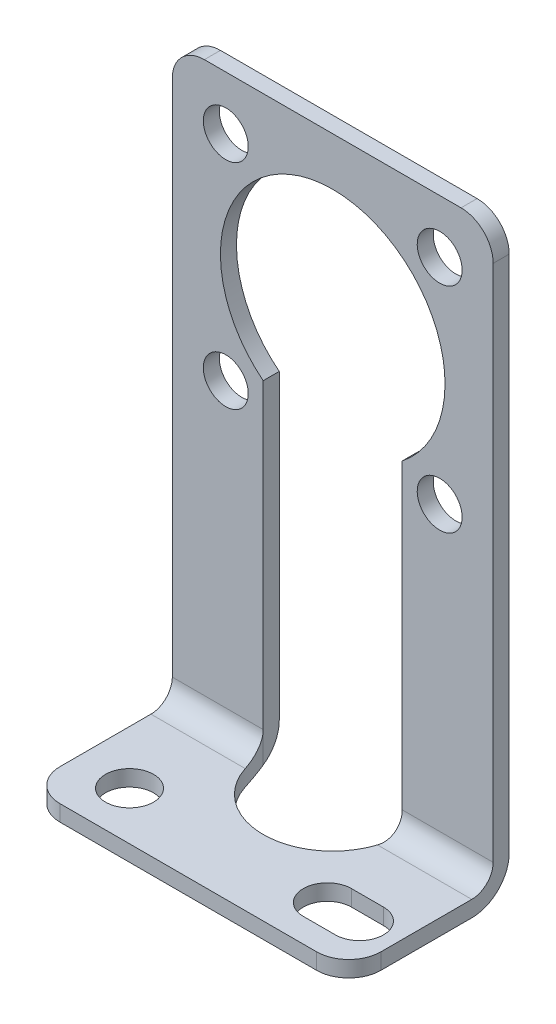
ISO-10303-21;
HEADER;
FILE_DESCRIPTION(('STEP AP214'),'2;1');
FILE_NAME('part.step','',(''),(''),'','','');
FILE_SCHEMA(('AUTOMOTIVE_DESIGN { 1 0 10303 214 1 1 1 1 }'));
ENDSEC;
DATA;
#1=APPLICATION_CONTEXT('core data for automotive mechanical design processes');
#2=APPLICATION_PROTOCOL_DEFINITION('international standard','automotive_design',2000,#1);
#3=PRODUCT_CONTEXT('',#1,'mechanical');
#4=PRODUCT('Part','Part','',(#3));
#5=PRODUCT_RELATED_PRODUCT_CATEGORY('part','',(#4));
#6=PRODUCT_DEFINITION_FORMATION('','',#4);
#7=PRODUCT_DEFINITION_CONTEXT('part definition',#1,'design');
#8=PRODUCT_DEFINITION('design','',#6,#7);
#9=PRODUCT_DEFINITION_SHAPE('','',#8);
#10=(LENGTH_UNIT() NAMED_UNIT(*) SI_UNIT(.MILLI.,.METRE.));
#11=(NAMED_UNIT(*) PLANE_ANGLE_UNIT() SI_UNIT($,.RADIAN.));
#12=(NAMED_UNIT(*) SI_UNIT($,.STERADIAN.) SOLID_ANGLE_UNIT());
#13=UNCERTAINTY_MEASURE_WITH_UNIT(LENGTH_MEASURE(1.E-05),#10,'distance_accuracy_value','');
#14=(GEOMETRIC_REPRESENTATION_CONTEXT(3) GLOBAL_UNCERTAINTY_ASSIGNED_CONTEXT((#13)) GLOBAL_UNIT_ASSIGNED_CONTEXT((#10,
#11,#12)) REPRESENTATION_CONTEXT('',''));
#15=CARTESIAN_POINT('',(0.,0.,0.));
#16=DIRECTION('',(0.,0.,1.));
#17=DIRECTION('',(1.,0.,0.));
#18=AXIS2_PLACEMENT_3D('',#15,#16,#17);
#19=CARTESIAN_POINT('',(23.5,55.001,-4.50000000000001));
#20=DIRECTION('',(0.,-1.,0.));
#21=DIRECTION('',(0.,0.,-1.));
#22=AXIS2_PLACEMENT_3D('',#19,#20,#21);
#23=CYLINDRICAL_SURFACE('',#22,2.25);
#24=DIRECTION('',(0.,1.,0.));
#25=VECTOR('',#24,1.);
#26=CARTESIAN_POINT('',(23.5,55.001,-2.25000000000001));
#27=LINE('',#26,#25);
#28=CARTESIAN_POINT('',(23.5,1.50000000000001,-2.25000000000001));
#29=VERTEX_POINT('',#28);
#30=CARTESIAN_POINT('',(23.5,0.,-2.25000000000001));
#31=VERTEX_POINT('',#30);
#32=EDGE_CURVE('E229',#29,#31,#27,.F.);
#33=ORIENTED_EDGE('',*,*,#32,.T.);
#34=CARTESIAN_POINT('',(23.5,0.,-4.50000000000001));
#35=DIRECTION('',(0.,-1.,0.));
#36=DIRECTION('',(0.,0.,-1.));
#37=AXIS2_PLACEMENT_3D('',#34,#35,#36);
#38=CIRCLE('',#37,2.25);
#39=CARTESIAN_POINT('',(23.5,0.,-6.75000000000001));
#40=VERTEX_POINT('',#39);
#41=EDGE_CURVE('E205',#31,#40,#38,.T.);
#42=ORIENTED_EDGE('',*,*,#41,.T.);
#43=DIRECTION('',(0.,1.,0.));
#44=VECTOR('',#43,1.);
#45=CARTESIAN_POINT('',(23.5,55.001,-6.75000000000001));
#46=LINE('',#45,#44);
#47=CARTESIAN_POINT('',(23.5,1.50000000000001,-6.75000000000001));
#48=VERTEX_POINT('',#47);
#49=EDGE_CURVE('E222',#40,#48,#46,.T.);
#50=ORIENTED_EDGE('',*,*,#49,.T.);
#51=CARTESIAN_POINT('',(23.5,1.50000000000001,-4.50000000000001));
#52=DIRECTION('',(0.,-1.,0.));
#53=DIRECTION('',(0.,0.,-1.));
#54=AXIS2_PLACEMENT_3D('',#51,#52,#53);
#55=CIRCLE('',#54,2.25);
#56=EDGE_CURVE('E351',#48,#29,#55,.F.);
#57=ORIENTED_EDGE('',*,*,#56,.T.);
#58=EDGE_LOOP('',(#33,#42,#50,#57));
#59=FACE_BOUND('',#58,.T.);
#60=ADVANCED_FACE('F16',(#59),#23,.F.);
#61=CARTESIAN_POINT('',(26.5,55.001,-2.25000000000001));
#62=DIRECTION('',(0.,0.,1.));
#63=DIRECTION('',(1.,0.,0.));
#64=AXIS2_PLACEMENT_3D('',#61,#62,#63);
#65=PLANE('',#64);
#66=DIRECTION('',(0.,-1.,0.));
#67=VECTOR('',#66,1.);
#68=CARTESIAN_POINT('',(26.5,55.001,-2.25000000000001));
#69=LINE('',#68,#67);
#70=CARTESIAN_POINT('',(26.5,1.50000000000002,-2.25000000000001));
#71=VERTEX_POINT('',#70);
#72=CARTESIAN_POINT('',(26.5,0.,-2.25000000000001));
#73=VERTEX_POINT('',#72);
#74=EDGE_CURVE('E225',#71,#73,#69,.T.);
#75=ORIENTED_EDGE('',*,*,#74,.T.);
#76=DIRECTION('',(1.,0.,0.));
#77=VECTOR('',#76,1.);
#78=CARTESIAN_POINT('',(30.,0.,-2.25000000000001));
#79=LINE('',#78,#77);
#80=EDGE_CURVE('E197',#73,#31,#79,.F.);
#81=ORIENTED_EDGE('',*,*,#80,.T.);
#82=ORIENTED_EDGE('',*,*,#32,.F.);
#83=DIRECTION('',(1.,0.,0.));
#84=VECTOR('',#83,1.);
#85=CARTESIAN_POINT('',(30.,1.5,-2.25000000000001));
#86=LINE('',#85,#84);
#87=EDGE_CURVE('E350',#29,#71,#86,.T.);
#88=ORIENTED_EDGE('',*,*,#87,.T.);
#89=EDGE_LOOP('',(#75,#81,#82,#88));
#90=FACE_BOUND('',#89,.T.);
#91=ADVANCED_FACE('F507',(#90),#65,.F.);
#92=CARTESIAN_POINT('',(26.5,55.001,-4.50000000000001));
#93=DIRECTION('',(0.,-1.,0.));
#94=DIRECTION('',(0.,0.,-1.));
#95=AXIS2_PLACEMENT_3D('',#92,#93,#94);
#96=CYLINDRICAL_SURFACE('',#95,2.25);
#97=DIRECTION('',(0.,1.,0.));
#98=VECTOR('',#97,1.);
#99=CARTESIAN_POINT('',(26.5,55.001,-6.75000000000001));
#100=LINE('',#99,#98);
#101=CARTESIAN_POINT('',(26.5,1.50000000000002,-6.75000000000001));
#102=VERTEX_POINT('',#101);
#103=CARTESIAN_POINT('',(26.5,0.,-6.75000000000001));
#104=VERTEX_POINT('',#103);
#105=EDGE_CURVE('E223',#102,#104,#100,.F.);
#106=ORIENTED_EDGE('',*,*,#105,.T.);
#107=CARTESIAN_POINT('',(26.5,0.,-4.50000000000001));
#108=DIRECTION('',(0.,-1.,0.));
#109=DIRECTION('',(0.,0.,-1.));
#110=AXIS2_PLACEMENT_3D('',#107,#108,#109);
#111=CIRCLE('',#110,2.25);
#112=EDGE_CURVE('E201',#104,#73,#111,.T.);
#113=ORIENTED_EDGE('',*,*,#112,.T.);
#114=ORIENTED_EDGE('',*,*,#74,.F.);
#115=CARTESIAN_POINT('',(26.5,1.50000000000003,-4.50000000000001));
#116=DIRECTION('',(0.,-1.,0.));
#117=DIRECTION('',(0.,0.,-1.));
#118=AXIS2_PLACEMENT_3D('',#115,#116,#117);
#119=CIRCLE('',#118,2.25);
#120=EDGE_CURVE('E347',#71,#102,#119,.F.);
#121=ORIENTED_EDGE('',*,*,#120,.T.);
#122=EDGE_LOOP('',(#106,#113,#114,#121));
#123=FACE_BOUND('',#122,.T.);
#124=ADVANCED_FACE('F517',(#123),#96,.F.);
#125=CARTESIAN_POINT('',(26.5,55.001,-6.75000000000001));
#126=DIRECTION('',(0.,0.,-1.));
#127=DIRECTION('',(-1.,0.,0.));
#128=AXIS2_PLACEMENT_3D('',#125,#126,#127);
#129=PLANE('',#128);
#130=ORIENTED_EDGE('',*,*,#49,.F.);
#131=DIRECTION('',(1.,0.,0.));
#132=VECTOR('',#131,1.);
#133=CARTESIAN_POINT('',(30.,0.,-6.75000000000001));
#134=LINE('',#133,#132);
#135=EDGE_CURVE('E202',#40,#104,#134,.T.);
#136=ORIENTED_EDGE('',*,*,#135,.T.);
#137=ORIENTED_EDGE('',*,*,#105,.F.);
#138=DIRECTION('',(1.,0.,0.));
#139=VECTOR('',#138,1.);
#140=CARTESIAN_POINT('',(30.,1.50000000000001,-6.75000000000001));
#141=LINE('',#140,#139);
#142=EDGE_CURVE('E346',#102,#48,#141,.F.);
#143=ORIENTED_EDGE('',*,*,#142,.T.);
#144=EDGE_LOOP('',(#130,#136,#137,#143));
#145=FACE_BOUND('',#144,.T.);
#146=ADVANCED_FACE('F515',(#145),#129,.F.);
#147=CARTESIAN_POINT('',(5.,55.001,-4.50000000000001));
#148=DIRECTION('',(0.,-1.,0.));
#149=DIRECTION('',(0.,0.,-1.));
#150=AXIS2_PLACEMENT_3D('',#147,#148,#149);
#151=CYLINDRICAL_SURFACE('',#150,2.25);
#152=CARTESIAN_POINT('',(5.,0.,-4.50000000000001));
#153=DIRECTION('',(0.,-1.,0.));
#154=DIRECTION('',(0.,0.,-1.));
#155=AXIS2_PLACEMENT_3D('',#152,#153,#154);
#156=CIRCLE('',#155,2.25);
#157=CARTESIAN_POINT('',(5.,0.,-6.75000000000001));
#158=VERTEX_POINT('',#157);
#159=EDGE_CURVE('E200',#158,#158,#156,.T.);
#160=ORIENTED_EDGE('',*,*,#159,.T.);
#161=EDGE_LOOP('',(#160));
#162=FACE_BOUND('',#161,.T.);
#163=CARTESIAN_POINT('',(5.,1.5,-4.50000000000001));
#164=DIRECTION('',(0.,-1.,0.));
#165=DIRECTION('',(0.,0.,-1.));
#166=AXIS2_PLACEMENT_3D('',#163,#164,#165);
#167=CIRCLE('',#166,2.25);
#168=CARTESIAN_POINT('',(5.,1.5,-6.75000000000001));
#169=VERTEX_POINT('',#168);
#170=EDGE_CURVE('E343',#169,#169,#167,.F.);
#171=ORIENTED_EDGE('',*,*,#170,.T.);
#172=EDGE_LOOP('',(#171));
#173=FACE_BOUND('',#172,.T.);
#174=ADVANCED_FACE('F670',(#162,#173),#151,.F.);
#175=CARTESIAN_POINT('',(27.,0.,-3.));
#176=DIRECTION('',(0.,-1.,0.));
#177=DIRECTION('',(0.,0.,-1.));
#178=AXIS2_PLACEMENT_3D('',#175,#176,#177);
#179=CYLINDRICAL_SURFACE('',#178,3.);
#180=CARTESIAN_POINT('',(27.,0.,-3.));
#181=DIRECTION('',(0.,-1.,0.));
#182=DIRECTION('',(0.,0.,-1.));
#183=AXIS2_PLACEMENT_3D('',#180,#181,#182);
#184=CIRCLE('',#183,3.);
#185=CARTESIAN_POINT('',(27.,0.,0.));
#186=VERTEX_POINT('',#185);
#187=CARTESIAN_POINT('',(30.,0.,-3.));
#188=VERTEX_POINT('',#187);
#189=EDGE_CURVE('E186',#186,#188,#184,.F.);
#190=ORIENTED_EDGE('',*,*,#189,.T.);
#191=DIRECTION('',(0.,-1.,0.));
#192=VECTOR('',#191,1.);
#193=CARTESIAN_POINT('',(30.,0.,-3.));
#194=LINE('',#193,#192);
#195=CARTESIAN_POINT('',(30.,1.50000000000001,-3.));
#196=VERTEX_POINT('',#195);
#197=EDGE_CURVE('E220',#188,#196,#194,.F.);
#198=ORIENTED_EDGE('',*,*,#197,.T.);
#199=CARTESIAN_POINT('',(27.,1.50000000000001,-3.));
#200=DIRECTION('',(0.,-1.,0.));
#201=DIRECTION('',(0.,0.,-1.));
#202=AXIS2_PLACEMENT_3D('',#199,#200,#201);
#203=CIRCLE('',#202,3.);
#204=CARTESIAN_POINT('',(27.,1.5,0.));
#205=VERTEX_POINT('',#204);
#206=EDGE_CURVE('E340',#196,#205,#203,.T.);
#207=ORIENTED_EDGE('',*,*,#206,.T.);
#208=DIRECTION('',(0.,1.,0.));
#209=VECTOR('',#208,1.);
#210=CARTESIAN_POINT('',(27.,0.,0.));
#211=LINE('',#210,#209);
#212=EDGE_CURVE('E218',#205,#186,#211,.F.);
#213=ORIENTED_EDGE('',*,*,#212,.T.);
#214=EDGE_LOOP('',(#190,#198,#207,#213));
#215=FACE_BOUND('',#214,.T.);
#216=ADVANCED_FACE('F661',(#215),#179,.T.);
#217=CARTESIAN_POINT('',(30.,0.,0.));
#218=DIRECTION('',(0.,0.,-1.));
#219=DIRECTION('',(-1.,0.,0.));
#220=AXIS2_PLACEMENT_3D('',#217,#218,#219);
#221=PLANE('',#220);
#222=DIRECTION('',(0.,1.,0.));
#223=VECTOR('',#222,1.);
#224=CARTESIAN_POINT('',(3.,0.,0.));
#225=LINE('',#224,#223);
#226=CARTESIAN_POINT('',(3.,0.,0.));
#227=VERTEX_POINT('',#226);
#228=CARTESIAN_POINT('',(3.,1.5,0.));
#229=VERTEX_POINT('',#228);
#230=EDGE_CURVE('E170',#227,#229,#225,.T.);
#231=ORIENTED_EDGE('',*,*,#230,.F.);
#232=DIRECTION('',(1.,0.,0.));
#233=VECTOR('',#232,1.);
#234=CARTESIAN_POINT('',(30.,0.,0.));
#235=LINE('',#234,#233);
#236=EDGE_CURVE('E189',#227,#186,#235,.T.);
#237=ORIENTED_EDGE('',*,*,#236,.T.);
#238=ORIENTED_EDGE('',*,*,#212,.F.);
#239=DIRECTION('',(1.,0.,0.));
#240=VECTOR('',#239,1.);
#241=CARTESIAN_POINT('',(30.,1.5,0.));
#242=LINE('',#241,#240);
#243=EDGE_CURVE('E339',#205,#229,#242,.F.);
#244=ORIENTED_EDGE('',*,*,#243,.T.);
#245=EDGE_LOOP('',(#231,#237,#238,#244));
#246=FACE_BOUND('',#245,.T.);
#247=ADVANCED_FACE('F652',(#246),#221,.F.);
#248=CARTESIAN_POINT('',(3.,0.,-3.));
#249=DIRECTION('',(0.,1.,0.));
#250=DIRECTION('',(0.,0.,1.));
#251=AXIS2_PLACEMENT_3D('',#248,#249,#250);
#252=CYLINDRICAL_SURFACE('',#251,3.);
#253=CARTESIAN_POINT('',(3.,0.,-3.));
#254=DIRECTION('',(0.,1.,0.));
#255=DIRECTION('',(0.,0.,1.));
#256=AXIS2_PLACEMENT_3D('',#253,#254,#255);
#257=CIRCLE('',#256,3.);
#258=CARTESIAN_POINT('',(0.,0.,-3.));
#259=VERTEX_POINT('',#258);
#260=EDGE_CURVE('E196',#259,#227,#257,.T.);
#261=ORIENTED_EDGE('',*,*,#260,.T.);
#262=ORIENTED_EDGE('',*,*,#230,.T.);
#263=CARTESIAN_POINT('',(3.,1.5,-3.));
#264=DIRECTION('',(0.,1.,0.));
#265=DIRECTION('',(0.,0.,1.));
#266=AXIS2_PLACEMENT_3D('',#263,#264,#265);
#267=CIRCLE('',#266,3.);
#268=CARTESIAN_POINT('',(0.,1.5,-3.));
#269=VERTEX_POINT('',#268);
#270=EDGE_CURVE('E336',#229,#269,#267,.F.);
#271=ORIENTED_EDGE('',*,*,#270,.T.);
#272=DIRECTION('',(0.,1.,0.));
#273=VECTOR('',#272,1.);
#274=CARTESIAN_POINT('',(0.,0.,-3.));
#275=LINE('',#274,#273);
#276=EDGE_CURVE('E216',#269,#259,#275,.F.);
#277=ORIENTED_EDGE('',*,*,#276,.T.);
#278=EDGE_LOOP('',(#261,#262,#271,#277));
#279=FACE_BOUND('',#278,.T.);
#280=ADVANCED_FACE('F645',(#279),#252,.T.);
#281=CARTESIAN_POINT('',(30.,3.5,-11.5));
#282=DIRECTION('',(-1.,0.,0.));
#283=DIRECTION('',(0.,0.,1.));
#284=AXIS2_PLACEMENT_3D('',#281,#282,#283);
#285=CYLINDRICAL_SURFACE('',#284,3.5);
#286=CARTESIAN_POINT('',(21.5,3.5,-11.5));
#287=DIRECTION('',(-1.,0.,0.));
#288=DIRECTION('',(0.,0.,1.));
#289=AXIS2_PLACEMENT_3D('',#286,#287,#288);
#290=CIRCLE('',#289,3.5);
#291=CARTESIAN_POINT('',(21.5,0.627718676730986,-13.5));
#292=VERTEX_POINT('',#291);
#293=CARTESIAN_POINT('',(21.5,3.5,-15.));
#294=VERTEX_POINT('',#293);
#295=EDGE_CURVE('E485',#292,#294,#290,.F.);
#296=ORIENTED_EDGE('',*,*,#295,.T.);
#297=DIRECTION('',(1.,0.,0.));
#298=VECTOR('',#297,1.);
#299=CARTESIAN_POINT('',(30.,3.5,-15.));
#300=LINE('',#299,#298);
#301=CARTESIAN_POINT('',(30.,3.5,-15.));
#302=VERTEX_POINT('',#301);
#303=EDGE_CURVE('E169',#294,#302,#300,.T.);
#304=ORIENTED_EDGE('',*,*,#303,.T.);
#305=CARTESIAN_POINT('',(30.,3.5,-11.5));
#306=DIRECTION('',(-1.,0.,0.));
#307=DIRECTION('',(0.,0.,1.));
#308=AXIS2_PLACEMENT_3D('',#305,#306,#307);
#309=CIRCLE('',#308,3.5);
#310=CARTESIAN_POINT('',(30.,0.,-11.5));
#311=VERTEX_POINT('',#310);
#312=EDGE_CURVE('E185',#302,#311,#309,.T.);
#313=ORIENTED_EDGE('',*,*,#312,.T.);
#314=DIRECTION('',(1.,0.,0.));
#315=VECTOR('',#314,1.);
#316=CARTESIAN_POINT('',(30.,0.,-11.5));
#317=LINE('',#316,#315);
#318=CARTESIAN_POINT('',(21.1846584384265,0.,-11.5));
#319=VERTEX_POINT('',#318);
#320=EDGE_CURVE('E176',#311,#319,#317,.F.);
#321=ORIENTED_EDGE('',*,*,#320,.T.);
#322=CARTESIAN_POINT('',(21.1846584384265,0.,-11.5));
#323=CARTESIAN_POINT('',(21.2126192461021,-1.47776893110457E-05,-11.5864103152324));
#324=CARTESIAN_POINT('',(21.2387426422125,0.00319974592441999,-11.6734305971561));
#325=CARTESIAN_POINT('',(21.2872230381251,0.0162507806863622,-11.8480375639755));
#326=CARTESIAN_POINT('',(21.3095793342303,0.0260885273467275,-11.9356243515288));
#327=CARTESIAN_POINT('',(21.34985016532,0.052178115311759,-12.1082210105445));
#328=CARTESIAN_POINT('',(21.3678717713789,0.0682421486276391,-12.1932341998812));
#329=CARTESIAN_POINT('',(21.4002698055881,0.106820423426476,-12.3624743543069));
#330=CARTESIAN_POINT('',(21.4146468181527,0.129333629543181,-12.4467014433588));
#331=CARTESIAN_POINT('',(21.439983274154,0.181050013754739,-12.6146170374571));
#332=CARTESIAN_POINT('',(21.4509042366898,0.210322641547532,-12.69828996839));
#333=CARTESIAN_POINT('',(21.4692960360574,0.275293974888231,-12.8635080589744));
#334=CARTESIAN_POINT('',(21.476766251039,0.310993837061454,-12.9450528326201));
#335=CARTESIAN_POINT('',(21.488677716582,0.389746198571779,-13.1077049800465));
#336=CARTESIAN_POINT('',(21.4930241065601,0.432983024819098,-13.1887299852529));
#337=CARTESIAN_POINT('',(21.4986901404819,0.525725831234505,-13.3472000626112));
#338=CARTESIAN_POINT('',(21.5000103793516,0.575230577141507,-13.4246458354881));
#339=CARTESIAN_POINT('',(21.5,0.627718676730986,-13.5));
#340=B_SPLINE_CURVE_WITH_KNOTS('',3,(#322,#323,#324,#325,#326,#327,#328,#329,#330,#331,#332,
#333,#334,#335,#336,#337,#338,#339),.UNSPECIFIED.,.F.,.F.,(4,2,2,2,2,2,2,2,4),(0.,
0.272409508598649,0.544869847215541,0.80968171777927,1.07445109858935,1.34207247539775,
1.60974206075261,1.88523110619515,2.16066598723716),.UNSPECIFIED.);
#341=EDGE_CURVE('E19',#319,#292,#340,.T.);
#342=ORIENTED_EDGE('',*,*,#341,.T.);
#343=EDGE_LOOP('',(#296,#304,#313,#321,#342));
#344=FACE_BOUND('',#343,.T.);
#345=ADVANCED_FACE('F183',(#344),#285,.T.);
#346=CARTESIAN_POINT('',(15.,55.001,-13.5));
#347=DIRECTION('',(0.,-1.,0.));
#348=DIRECTION('',(0.,0.,-1.));
#349=AXIS2_PLACEMENT_3D('',#346,#347,#348);
#350=CYLINDRICAL_SURFACE('',#349,6.5);
#351=CARTESIAN_POINT('',(8.5,0.627718676730986,-13.5));
#352=CARTESIAN_POINT('',(8.49999012513292,0.575820713429753,-13.4254921194431));
#353=CARTESIAN_POINT('',(8.50128062178582,0.526839008212426,-13.3489399976596));
#354=CARTESIAN_POINT('',(8.50681542744663,0.434999405386153,-13.1923316167673));
#355=CARTESIAN_POINT('',(8.51106026996644,0.392142615533008,-13.1122747271957));
#356=CARTESIAN_POINT('',(8.52269145668762,0.313976258803868,-12.9515572646888));
#357=CARTESIAN_POINT('',(8.52998623421595,0.278488548313346,-12.8709767764647));
#358=CARTESIAN_POINT('',(8.5479446252212,0.213795215819289,-12.7077107568048));
#359=CARTESIAN_POINT('',(8.55860770143075,0.1845885931859,-12.6250255630168));
#360=CARTESIAN_POINT('',(8.58362008864896,0.132286428149437,-12.4572427890859));
#361=CARTESIAN_POINT('',(8.59800970855165,0.109263701811073,-12.372128504525));
#362=CARTESIAN_POINT('',(8.6305125344359,0.0698096568207672,-12.2010719767515));
#363=CARTESIAN_POINT('',(8.64862641175557,0.0533795281348591,-12.1151295869298));
#364=CARTESIAN_POINT('',(8.6891743570207,0.0266900653865563,-11.9406020232384));
#365=CARTESIAN_POINT('',(8.71171913339047,0.0166249351059505,-11.8520129605245));
#366=CARTESIAN_POINT('',(8.76066362443995,0.00327282505407418,-11.6754078524712));
#367=CARTESIAN_POINT('',(8.78706256326093,-1.55169034032131E-05,-11.5873916955196));
#368=CARTESIAN_POINT('',(8.81534156157351,0.,-11.5));
#369=B_SPLINE_CURVE_WITH_KNOTS('',3,(#351,#352,#353,#354,#355,#356,#357,#358,#359,#360,#361,
#362,#363,#364,#365,#366,#367,#368),.UNSPECIFIED.,.F.,.F.,(4,2,2,2,2,2,2,2,4),(0.,
0.272341587759512,0.544732369213966,0.80947390937836,1.07417324270629,1.34186490849213,
1.60960487099892,1.88516312555608,2.16066598539506),.UNSPECIFIED.);
#370=CARTESIAN_POINT('',(8.5,0.627718676730986,-13.5));
#371=VERTEX_POINT('',#370);
#372=CARTESIAN_POINT('',(8.81534156157351,0.,-11.5));
#373=VERTEX_POINT('',#372);
#374=EDGE_CURVE('E208',#371,#373,#369,.T.);
#375=ORIENTED_EDGE('',*,*,#374,.F.);
#376=DIRECTION('',(0.,-1.,0.));
#377=VECTOR('',#376,1.);
#378=CARTESIAN_POINT('',(8.5,0.,-13.5));
#379=LINE('',#378,#377);
#380=CARTESIAN_POINT('',(8.5,3.50000000000002,-13.5));
#381=VERTEX_POINT('',#380);
#382=EDGE_CURVE('E469',#371,#381,#379,.F.);
#383=ORIENTED_EDGE('',*,*,#382,.T.);
#384=CARTESIAN_POINT('',(8.5,3.50000000000002,-13.5));
#385=CARTESIAN_POINT('',(8.50000419292157,3.44378325689567,-13.499999619));
#386=CARTESIAN_POINT('',(8.49999952812652,3.38759343088327,-13.4976282719413));
#387=CARTESIAN_POINT('',(8.50000823118077,3.27561489759506,-13.4881679307896));
#388=CARTESIAN_POINT('',(8.50002159823695,3.21982617278538,-13.4810791441992));
#389=CARTESIAN_POINT('',(8.50014224224176,3.05373942230678,-13.4528007140327));
#390=CARTESIAN_POINT('',(8.50032986271312,2.94455208725012,-13.4245988349063));
#391=CARTESIAN_POINT('',(8.50161953633517,2.7324562698668,-13.3502777372269));
#392=CARTESIAN_POINT('',(8.50272207614265,2.62955116041334,-13.3041489900975));
#393=CARTESIAN_POINT('',(8.50691801194977,2.43296512822463,-13.1953019484915));
#394=CARTESIAN_POINT('',(8.51001108038838,2.33928269073217,-13.1325863845385));
#395=CARTESIAN_POINT('',(8.51945007151245,2.16420393194991,-12.992700984432));
#396=CARTESIAN_POINT('',(8.52578312568022,2.08276064265295,-12.9155890910972));
#397=CARTESIAN_POINT('',(8.54297315412635,1.93408769484453,-12.7491446969476));
#398=CARTESIAN_POINT('',(8.55382925557719,1.86685529778088,-12.6598145561615));
#399=CARTESIAN_POINT('',(8.5809081461732,1.74942622496262,-12.4733643657334));
#400=CARTESIAN_POINT('',(8.59704170311582,1.69897266362983,-12.3763929159851));
#401=CARTESIAN_POINT('',(8.63534879630254,1.61478183310586,-12.1765378902551));
#402=CARTESIAN_POINT('',(8.65752264146227,1.58104541912076,-12.0736540121093));
#403=CARTESIAN_POINT('',(8.70158243499521,1.53711927040648,-11.8917925529308));
#404=CARTESIAN_POINT('',(8.72211340937989,1.5231266609479,-11.8133740546298));
#405=CARTESIAN_POINT('',(8.76637144018483,1.50456357925422,-11.6564717921533));
#406=CARTESIAN_POINT('',(8.79009275662786,1.49997642037091,-11.5779883911282));
#407=CARTESIAN_POINT('',(8.81534156157351,1.50000000000002,-11.5));
#408=B_SPLINE_CURVE_WITH_KNOTS('',3,(#384,#385,#386,#387,#388,#389,#390,#391,#392,#393,#394,
#395,#396,#397,#398,#399,#400,#401,#402,#403,#404,#405,#406,#407),.UNSPECIFIED.,.F.,.F.,(4,2,2,
2,2,2,2,2,2,2,2,4),(0.,0.168546761049825,0.337086108840086,0.673665035562559,1.01042310758425,
1.34712577692528,1.68250140044656,2.01781233536953,2.34772391247711,2.6776523652669,
2.92385320842882,3.16961687592227),.UNSPECIFIED.);
#409=CARTESIAN_POINT('',(8.81534156157351,1.50000000000002,-11.5));
#410=VERTEX_POINT('',#409);
#411=EDGE_CURVE('E264',#381,#410,#408,.T.);
#412=ORIENTED_EDGE('',*,*,#411,.T.);
#413=CARTESIAN_POINT('',(15.,1.50000000000002,-13.5));
#414=DIRECTION('',(0.,-1.,0.));
#415=DIRECTION('',(0.,0.,-1.));
#416=AXIS2_PLACEMENT_3D('',#413,#414,#415);
#417=CIRCLE('',#416,6.5);
#418=CARTESIAN_POINT('',(21.1846584384265,1.50000000000002,-11.5));
#419=VERTEX_POINT('',#418);
#420=EDGE_CURVE('E334',#410,#419,#417,.F.);
#421=ORIENTED_EDGE('',*,*,#420,.T.);
#422=CARTESIAN_POINT('',(21.1846584384265,1.50000000000002,-11.5));
#423=CARTESIAN_POINT('',(21.2018987468286,1.50000039294165,-11.5533018987206));
#424=CARTESIAN_POINT('',(21.2184366527838,1.50213271132979,-11.6068102526365));
#425=CARTESIAN_POINT('',(21.2500435684351,1.51074678170557,-11.7139233841955));
#426=CARTESIAN_POINT('',(21.2651122226981,1.51722958316237,-11.7675281819914));
#427=CARTESIAN_POINT('',(21.3079780426405,1.54331354667552,-11.9278683756051));
#428=CARTESIAN_POINT('',(21.333469198937,1.56954994284516,-12.0342355782363));
#429=CARTESIAN_POINT('',(21.3781087107295,1.63970246572307,-12.2425701204419));
#430=CARTESIAN_POINT('',(21.397244784708,1.68365246636877,-12.3445286131722));
#431=CARTESIAN_POINT('',(21.4295439465914,1.78831522936105,-12.5404085412499));
#432=CARTESIAN_POINT('',(21.4427110340995,1.84901672312998,-12.6343353240155));
#433=CARTESIAN_POINT('',(21.4637478631989,1.98391785315629,-12.8089623219491));
#434=CARTESIAN_POINT('',(21.4717368420245,2.05775967694771,-12.8899252842838));
#435=CARTESIAN_POINT('',(21.4840530051314,2.21786150419287,-13.038856041204));
#436=CARTESIAN_POINT('',(21.4883788162409,2.304126150289,-13.1068189552197));
#437=CARTESIAN_POINT('',(21.4946083928696,2.48751090044679,-13.228317355458));
#438=CARTESIAN_POINT('',(21.4964891512177,2.58472489831643,-13.2817121111699));
#439=CARTESIAN_POINT('',(21.4988902752471,2.78663189835365,-13.3717138593046));
#440=CARTESIAN_POINT('',(21.4994111262788,2.89132221851576,-13.4083268372909));
#441=CARTESIAN_POINT('',(21.4998952888599,3.0801464305495,-13.4572638270313));
#442=CARTESIAN_POINT('',(21.4999606683525,3.16334689380744,-13.4732694868386));
#443=CARTESIAN_POINT('',(21.499999740056,3.33102163414366,-13.4946439168341));
#444=CARTESIAN_POINT('',(21.4999735197571,3.41549461902664,-13.500022829338));
#445=CARTESIAN_POINT('',(21.5,3.50000000000003,-13.5));
#446=B_SPLINE_CURVE_WITH_KNOTS('',3,(#422,#423,#424,#425,#426,#427,#428,#429,#430,#431,#432,
#433,#434,#435,#436,#437,#438,#439,#440,#441,#442,#443,#444,#445),.UNSPECIFIED.,.F.,.F.,(4,2,2,
2,2,2,2,2,2,2,2,4),(0.,0.167973393545476,0.335987321967298,0.671685192576146,1.00802809144686,
1.34414528470861,1.67221834285983,2.00041432780655,2.33167669923231,2.66282082705842,
2.91634689070451,3.16963086842352),.UNSPECIFIED.);
#447=CARTESIAN_POINT('',(21.5,3.50000000000003,-13.5));
#448=VERTEX_POINT('',#447);
#449=EDGE_CURVE('E305',#419,#448,#446,.T.);
#450=ORIENTED_EDGE('',*,*,#449,.T.);
#451=DIRECTION('',(0.,1.,0.));
#452=VECTOR('',#451,1.);
#453=CARTESIAN_POINT('',(21.5,0.,-13.5));
#454=LINE('',#453,#452);
#455=EDGE_CURVE('E164',#448,#292,#454,.F.);
#456=ORIENTED_EDGE('',*,*,#455,.T.);
#457=ORIENTED_EDGE('',*,*,#341,.F.);
#458=CARTESIAN_POINT('',(15.,0.,-13.5));
#459=DIRECTION('',(0.,-1.,0.));
#460=DIRECTION('',(0.,0.,-1.));
#461=AXIS2_PLACEMENT_3D('',#458,#459,#460);
#462=CIRCLE('',#461,6.5);
#463=EDGE_CURVE('E162',#319,#373,#462,.T.);
#464=ORIENTED_EDGE('',*,*,#463,.T.);
#465=EDGE_LOOP('',(#375,#383,#412,#421,#450,#456,#457,#464));
#466=FACE_BOUND('',#465,.T.);
#467=ADVANCED_FACE('F161',(#466),#350,.F.);
#468=CARTESIAN_POINT('',(30.,0.,-15.));
#469=DIRECTION('',(0.,0.,1.));
#470=DIRECTION('',(0.,-1.,0.));
#471=AXIS2_PLACEMENT_3D('',#468,#469,#470);
#472=PLANE('',#471);
#473=DIRECTION('',(-1.,0.,0.));
#474=VECTOR('',#473,1.);
#475=CARTESIAN_POINT('',(30.,3.5,-15.));
#476=LINE('',#475,#474);
#477=CARTESIAN_POINT('',(0.,3.5,-15.));
#478=VERTEX_POINT('',#477);
#479=CARTESIAN_POINT('',(8.5,3.5,-15.));
#480=VERTEX_POINT('',#479);
#481=EDGE_CURVE('E206',#478,#480,#476,.F.);
#482=ORIENTED_EDGE('',*,*,#481,.F.);
#483=DIRECTION('',(0.,1.,0.));
#484=VECTOR('',#483,1.);
#485=CARTESIAN_POINT('',(0.,0.,-15.));
#486=LINE('',#485,#484);
#487=CARTESIAN_POINT('',(0.,52.,-15.));
#488=VERTEX_POINT('',#487);
#489=EDGE_CURVE('E263',#488,#478,#486,.F.);
#490=ORIENTED_EDGE('',*,*,#489,.F.);
#491=CARTESIAN_POINT('',(3.,52.,-15.));
#492=DIRECTION('',(0.,0.,-1.));
#493=DIRECTION('',(0.,1.,0.));
#494=AXIS2_PLACEMENT_3D('',#491,#492,#493);
#495=CIRCLE('',#494,3.);
#496=CARTESIAN_POINT('',(3.,55.,-15.));
#497=VERTEX_POINT('',#496);
#498=EDGE_CURVE('E320',#497,#488,#495,.F.);
#499=ORIENTED_EDGE('',*,*,#498,.F.);
#500=DIRECTION('',(1.,0.,0.));
#501=VECTOR('',#500,1.);
#502=CARTESIAN_POINT('',(30.,55.,-15.));
#503=LINE('',#502,#501);
#504=CARTESIAN_POINT('',(27.,55.,-15.));
#505=VERTEX_POINT('',#504);
#506=EDGE_CURVE('E210',#497,#505,#503,.T.);
#507=ORIENTED_EDGE('',*,*,#506,.T.);
#508=CARTESIAN_POINT('',(27.,52.,-15.));
#509=DIRECTION('',(0.,0.,1.));
#510=DIRECTION('',(0.,-1.,0.));
#511=AXIS2_PLACEMENT_3D('',#508,#509,#510);
#512=CIRCLE('',#511,3.);
#513=CARTESIAN_POINT('',(30.,52.,-15.));
#514=VERTEX_POINT('',#513);
#515=EDGE_CURVE('E213',#514,#505,#512,.T.);
#516=ORIENTED_EDGE('',*,*,#515,.F.);
#517=DIRECTION('',(0.,1.,0.));
#518=VECTOR('',#517,1.);
#519=CARTESIAN_POINT('',(30.,0.,-15.));
#520=LINE('',#519,#518);
#521=EDGE_CURVE('E317',#514,#302,#520,.F.);
#522=ORIENTED_EDGE('',*,*,#521,.T.);
#523=ORIENTED_EDGE('',*,*,#303,.F.);
#524=DIRECTION('',(0.,1.,0.));
#525=VECTOR('',#524,1.);
#526=CARTESIAN_POINT('',(21.5,0.,-15.));
#527=LINE('',#526,#525);
#528=CARTESIAN_POINT('',(21.5,31.7537887487647,-15.));
#529=VERTEX_POINT('',#528);
#530=EDGE_CURVE('E482',#294,#529,#527,.T.);
#531=ORIENTED_EDGE('',*,*,#530,.T.);
#532=CARTESIAN_POINT('',(15.,40.,-15.));
#533=DIRECTION('',(0.,0.,-1.));
#534=DIRECTION('',(0.,1.,0.));
#535=AXIS2_PLACEMENT_3D('',#532,#533,#534);
#536=CIRCLE('',#535,10.5);
#537=CARTESIAN_POINT('',(8.5,31.7537887487647,-15.));
#538=VERTEX_POINT('',#537);
#539=EDGE_CURVE('E478',#529,#538,#536,.F.);
#540=ORIENTED_EDGE('',*,*,#539,.T.);
#541=DIRECTION('',(0.,-1.,0.));
#542=VECTOR('',#541,1.);
#543=CARTESIAN_POINT('',(8.5,0.,-15.));
#544=LINE('',#543,#542);
#545=EDGE_CURVE('E472',#538,#480,#544,.T.);
#546=ORIENTED_EDGE('',*,*,#545,.T.);
#547=EDGE_LOOP('',(#482,#490,#499,#507,#516,#522,#523,#531,#540,#546));
#548=FACE_BOUND('',#547,.T.);
#549=CARTESIAN_POINT('',(25.,30.,-15.));
#550=DIRECTION('',(0.,0.,-1.));
#551=DIRECTION('',(0.,1.,0.));
#552=AXIS2_PLACEMENT_3D('',#549,#550,#551);
#553=CIRCLE('',#552,2.1);
#554=CARTESIAN_POINT('',(25.,32.1,-15.));
#555=VERTEX_POINT('',#554);
#556=EDGE_CURVE('E322',#555,#555,#553,.F.);
#557=ORIENTED_EDGE('',*,*,#556,.T.);
#558=EDGE_LOOP('',(#557));
#559=FACE_BOUND('',#558,.T.);
#560=CARTESIAN_POINT('',(25.,50.,-15.));
#561=DIRECTION('',(0.,0.,-1.));
#562=DIRECTION('',(0.,1.,0.));
#563=AXIS2_PLACEMENT_3D('',#560,#561,#562);
#564=CIRCLE('',#563,2.1);
#565=CARTESIAN_POINT('',(25.,52.1,-15.));
#566=VERTEX_POINT('',#565);
#567=EDGE_CURVE('E325',#566,#566,#564,.F.);
#568=ORIENTED_EDGE('',*,*,#567,.T.);
#569=EDGE_LOOP('',(#568));
#570=FACE_BOUND('',#569,.T.);
#571=CARTESIAN_POINT('',(5.,50.,-15.));
#572=DIRECTION('',(0.,0.,-1.));
#573=DIRECTION('',(0.,1.,0.));
#574=AXIS2_PLACEMENT_3D('',#571,#572,#573);
#575=CIRCLE('',#574,2.1);
#576=CARTESIAN_POINT('',(5.,52.1,-15.));
#577=VERTEX_POINT('',#576);
#578=EDGE_CURVE('E328',#577,#577,#575,.F.);
#579=ORIENTED_EDGE('',*,*,#578,.T.);
#580=EDGE_LOOP('',(#579));
#581=FACE_BOUND('',#580,.T.);
#582=CARTESIAN_POINT('',(5.,30.,-15.));
#583=DIRECTION('',(0.,0.,-1.));
#584=DIRECTION('',(0.,1.,0.));
#585=AXIS2_PLACEMENT_3D('',#582,#583,#584);
#586=CIRCLE('',#585,2.09999999999999);
#587=CARTESIAN_POINT('',(5.,32.1,-15.));
#588=VERTEX_POINT('',#587);
#589=EDGE_CURVE('E331',#588,#588,#586,.F.);
#590=ORIENTED_EDGE('',*,*,#589,.T.);
#591=EDGE_LOOP('',(#590));
#592=FACE_BOUND('',#591,.T.);
#593=ADVANCED_FACE('F370',(#548,#559,#570,#581,#592),#472,.F.);
#594=CARTESIAN_POINT('',(30.,3.5,-11.5));
#595=DIRECTION('',(-1.,0.,0.));
#596=DIRECTION('',(0.,0.,1.));
#597=AXIS2_PLACEMENT_3D('',#594,#595,#596);
#598=CYLINDRICAL_SURFACE('',#597,3.5);
#599=ORIENTED_EDGE('',*,*,#481,.T.);
#600=CARTESIAN_POINT('',(8.5,3.5,-11.5));
#601=DIRECTION('',(-1.,0.,0.));
#602=DIRECTION('',(0.,0.,1.));
#603=AXIS2_PLACEMENT_3D('',#600,#601,#602);
#604=CIRCLE('',#603,3.5);
#605=EDGE_CURVE('E273',#480,#371,#604,.T.);
#606=ORIENTED_EDGE('',*,*,#605,.T.);
#607=ORIENTED_EDGE('',*,*,#374,.T.);
#608=DIRECTION('',(1.,0.,0.));
#609=VECTOR('',#608,1.);
#610=CARTESIAN_POINT('',(30.,0.,-11.5));
#611=LINE('',#610,#609);
#612=CARTESIAN_POINT('',(0.,0.,-11.5));
#613=VERTEX_POINT('',#612);
#614=EDGE_CURVE('E180',#373,#613,#611,.F.);
#615=ORIENTED_EDGE('',*,*,#614,.T.);
#616=CARTESIAN_POINT('',(0.,3.5,-11.5));
#617=DIRECTION('',(-1.,0.,0.));
#618=DIRECTION('',(0.,0.,1.));
#619=AXIS2_PLACEMENT_3D('',#616,#617,#618);
#620=CIRCLE('',#619,3.5);
#621=EDGE_CURVE('E260',#478,#613,#620,.T.);
#622=ORIENTED_EDGE('',*,*,#621,.F.);
#623=EDGE_LOOP('',(#599,#606,#607,#615,#622));
#624=FACE_BOUND('',#623,.T.);
#625=ADVANCED_FACE('F366',(#624),#598,.T.);
#626=CARTESIAN_POINT('',(30.,0.,0.));
#627=DIRECTION('',(0.,1.,0.));
#628=DIRECTION('',(0.,0.,1.));
#629=AXIS2_PLACEMENT_3D('',#626,#627,#628);
#630=PLANE('',#629);
#631=ORIENTED_EDGE('',*,*,#614,.F.);
#632=ORIENTED_EDGE('',*,*,#463,.F.);
#633=ORIENTED_EDGE('',*,*,#320,.F.);
#634=DIRECTION('',(0.,0.,1.));
#635=VECTOR('',#634,1.);
#636=CARTESIAN_POINT('',(30.,0.,0.));
#637=LINE('',#636,#635);
#638=EDGE_CURVE('E316',#311,#188,#637,.T.);
#639=ORIENTED_EDGE('',*,*,#638,.T.);
#640=ORIENTED_EDGE('',*,*,#189,.F.);
#641=ORIENTED_EDGE('',*,*,#236,.F.);
#642=ORIENTED_EDGE('',*,*,#260,.F.);
#643=DIRECTION('',(0.,0.,1.));
#644=VECTOR('',#643,1.);
#645=CARTESIAN_POINT('',(0.,0.,0.));
#646=LINE('',#645,#644);
#647=EDGE_CURVE('E262',#613,#259,#646,.T.);
#648=ORIENTED_EDGE('',*,*,#647,.F.);
#649=EDGE_LOOP('',(#631,#632,#633,#639,#640,#641,#642,#648));
#650=FACE_BOUND('',#649,.T.);
#651=ORIENTED_EDGE('',*,*,#159,.F.);
#652=EDGE_LOOP('',(#651));
#653=FACE_BOUND('',#652,.T.);
#654=ORIENTED_EDGE('',*,*,#112,.F.);
#655=ORIENTED_EDGE('',*,*,#135,.F.);
#656=ORIENTED_EDGE('',*,*,#41,.F.);
#657=ORIENTED_EDGE('',*,*,#80,.F.);
#658=EDGE_LOOP('',(#654,#655,#656,#657));
#659=FACE_BOUND('',#658,.T.);
#660=ADVANCED_FACE('F173',(#650,#653,#659),#630,.F.);
#661=CARTESIAN_POINT('',(30.,1.50000000000003,-13.5));
#662=DIRECTION('',(0.,-1.,0.));
#663=DIRECTION('',(0.,0.,-1.));
#664=AXIS2_PLACEMENT_3D('',#661,#662,#663);
#665=PLANE('',#664);
#666=DIRECTION('',(1.,0.,0.));
#667=VECTOR('',#666,1.);
#668=CARTESIAN_POINT('',(30.,1.50000000000002,-11.5));
#669=LINE('',#668,#667);
#670=CARTESIAN_POINT('',(0.,1.50000000000002,-11.5));
#671=VERTEX_POINT('',#670);
#672=EDGE_CURVE('E272',#410,#671,#669,.F.);
#673=ORIENTED_EDGE('',*,*,#672,.T.);
#674=DIRECTION('',(0.,0.,1.));
#675=VECTOR('',#674,1.);
#676=CARTESIAN_POINT('',(0.,1.50000000000001,0.));
#677=LINE('',#676,#675);
#678=EDGE_CURVE('E259',#269,#671,#677,.F.);
#679=ORIENTED_EDGE('',*,*,#678,.F.);
#680=ORIENTED_EDGE('',*,*,#270,.F.);
#681=ORIENTED_EDGE('',*,*,#243,.F.);
#682=ORIENTED_EDGE('',*,*,#206,.F.);
#683=DIRECTION('',(0.,0.,1.));
#684=VECTOR('',#683,1.);
#685=CARTESIAN_POINT('',(30.,1.50000000000001,0.));
#686=LINE('',#685,#684);
#687=CARTESIAN_POINT('',(30.,1.50000000000002,-11.5));
#688=VERTEX_POINT('',#687);
#689=EDGE_CURVE('E495',#196,#688,#686,.F.);
#690=ORIENTED_EDGE('',*,*,#689,.T.);
#691=DIRECTION('',(1.,0.,0.));
#692=VECTOR('',#691,1.);
#693=CARTESIAN_POINT('',(30.,1.50000000000002,-11.5));
#694=LINE('',#693,#692);
#695=EDGE_CURVE('E313',#688,#419,#694,.F.);
#696=ORIENTED_EDGE('',*,*,#695,.T.);
#697=ORIENTED_EDGE('',*,*,#420,.F.);
#698=EDGE_LOOP('',(#673,#679,#680,#681,#682,#690,#696,#697));
#699=FACE_BOUND('',#698,.T.);
#700=ORIENTED_EDGE('',*,*,#170,.F.);
#701=EDGE_LOOP('',(#700));
#702=FACE_BOUND('',#701,.T.);
#703=ORIENTED_EDGE('',*,*,#120,.F.);
#704=ORIENTED_EDGE('',*,*,#87,.F.);
#705=ORIENTED_EDGE('',*,*,#56,.F.);
#706=ORIENTED_EDGE('',*,*,#142,.F.);
#707=EDGE_LOOP('',(#703,#704,#705,#706));
#708=FACE_BOUND('',#707,.T.);
#709=ADVANCED_FACE('F403',(#699,#702,#708),#665,.F.);
#710=CARTESIAN_POINT('',(5.,30.,0.00100000000000447));
#711=DIRECTION('',(0.,0.,-1.));
#712=DIRECTION('',(0.,1.,0.));
#713=AXIS2_PLACEMENT_3D('',#710,#711,#712);
#714=CYLINDRICAL_SURFACE('',#713,2.09999999999999);
#715=ORIENTED_EDGE('',*,*,#589,.F.);
#716=EDGE_LOOP('',(#715));
#717=FACE_BOUND('',#716,.T.);
#718=CARTESIAN_POINT('',(5.,30.,-13.5));
#719=DIRECTION('',(0.,0.,-1.));
#720=DIRECTION('',(0.,1.,0.));
#721=AXIS2_PLACEMENT_3D('',#718,#719,#720);
#722=CIRCLE('',#721,2.09999999999999);
#723=CARTESIAN_POINT('',(5.,32.1,-13.5));
#724=VERTEX_POINT('',#723);
#725=EDGE_CURVE('E254',#724,#724,#722,.F.);
#726=ORIENTED_EDGE('',*,*,#725,.T.);
#727=EDGE_LOOP('',(#726));
#728=FACE_BOUND('',#727,.T.);
#729=ADVANCED_FACE('F400',(#717,#728),#714,.F.);
#730=CARTESIAN_POINT('',(5.,50.,0.00100000000000794));
#731=DIRECTION('',(0.,0.,-1.));
#732=DIRECTION('',(0.,1.,0.));
#733=AXIS2_PLACEMENT_3D('',#730,#731,#732);
#734=CYLINDRICAL_SURFACE('',#733,2.1);
#735=ORIENTED_EDGE('',*,*,#578,.F.);
#736=EDGE_LOOP('',(#735));
#737=FACE_BOUND('',#736,.T.);
#738=CARTESIAN_POINT('',(5.,50.,-13.5));
#739=DIRECTION('',(0.,0.,-1.));
#740=DIRECTION('',(0.,1.,0.));
#741=AXIS2_PLACEMENT_3D('',#738,#739,#740);
#742=CIRCLE('',#741,2.1);
#743=CARTESIAN_POINT('',(5.,52.1,-13.5));
#744=VERTEX_POINT('',#743);
#745=EDGE_CURVE('E251',#744,#744,#742,.F.);
#746=ORIENTED_EDGE('',*,*,#745,.T.);
#747=EDGE_LOOP('',(#746));
#748=FACE_BOUND('',#747,.T.);
#749=ADVANCED_FACE('F402',(#737,#748),#734,.F.);
#750=CARTESIAN_POINT('',(25.,50.,0.00100000000000794));
#751=DIRECTION('',(0.,0.,-1.));
#752=DIRECTION('',(0.,1.,0.));
#753=AXIS2_PLACEMENT_3D('',#750,#751,#752);
#754=CYLINDRICAL_SURFACE('',#753,2.1);
#755=ORIENTED_EDGE('',*,*,#567,.F.);
#756=EDGE_LOOP('',(#755));
#757=FACE_BOUND('',#756,.T.);
#758=CARTESIAN_POINT('',(25.,50.,-13.5));
#759=DIRECTION('',(0.,0.,-1.));
#760=DIRECTION('',(0.,1.,0.));
#761=AXIS2_PLACEMENT_3D('',#758,#759,#760);
#762=CIRCLE('',#761,2.1);
#763=CARTESIAN_POINT('',(25.,52.1,-13.5));
#764=VERTEX_POINT('',#763);
#765=EDGE_CURVE('E248',#764,#764,#762,.F.);
#766=ORIENTED_EDGE('',*,*,#765,.T.);
#767=EDGE_LOOP('',(#766));
#768=FACE_BOUND('',#767,.T.);
#769=ADVANCED_FACE('F410',(#757,#768),#754,.F.);
#770=CARTESIAN_POINT('',(25.,30.,0.00100000000000447));
#771=DIRECTION('',(0.,0.,-1.));
#772=DIRECTION('',(0.,1.,0.));
#773=AXIS2_PLACEMENT_3D('',#770,#771,#772);
#774=CYLINDRICAL_SURFACE('',#773,2.1);
#775=ORIENTED_EDGE('',*,*,#556,.F.);
#776=EDGE_LOOP('',(#775));
#777=FACE_BOUND('',#776,.T.);
#778=CARTESIAN_POINT('',(25.,30.,-13.5));
#779=DIRECTION('',(0.,0.,-1.));
#780=DIRECTION('',(0.,1.,0.));
#781=AXIS2_PLACEMENT_3D('',#778,#779,#780);
#782=CIRCLE('',#781,2.1);
#783=CARTESIAN_POINT('',(25.,32.1,-13.5));
#784=VERTEX_POINT('',#783);
#785=EDGE_CURVE('E245',#784,#784,#782,.F.);
#786=ORIENTED_EDGE('',*,*,#785,.T.);
#787=EDGE_LOOP('',(#786));
#788=FACE_BOUND('',#787,.T.);
#789=ADVANCED_FACE('F418',(#777,#788),#774,.F.);
#790=CARTESIAN_POINT('',(3.,52.,-15.));
#791=DIRECTION('',(0.,0.,-1.));
#792=DIRECTION('',(0.,1.,0.));
#793=AXIS2_PLACEMENT_3D('',#790,#791,#792);
#794=CYLINDRICAL_SURFACE('',#793,3.);
#795=CARTESIAN_POINT('',(3.,52.,-13.5));
#796=DIRECTION('',(0.,0.,-1.));
#797=DIRECTION('',(0.,1.,0.));
#798=AXIS2_PLACEMENT_3D('',#795,#796,#797);
#799=CIRCLE('',#798,3.);
#800=CARTESIAN_POINT('',(0.,52.,-13.5));
#801=VERTEX_POINT('',#800);
#802=CARTESIAN_POINT('',(3.,55.,-13.5));
#803=VERTEX_POINT('',#802);
#804=EDGE_CURVE('E242',#801,#803,#799,.T.);
#805=ORIENTED_EDGE('',*,*,#804,.T.);
#806=DIRECTION('',(0.,0.,-1.));
#807=VECTOR('',#806,1.);
#808=CARTESIAN_POINT('',(3.,55.,-15.));
#809=LINE('',#808,#807);
#810=EDGE_CURVE('E214',#803,#497,#809,.T.);
#811=ORIENTED_EDGE('',*,*,#810,.T.);
#812=ORIENTED_EDGE('',*,*,#498,.T.);
#813=DIRECTION('',(0.,0.,1.));
#814=VECTOR('',#813,1.);
#815=CARTESIAN_POINT('',(0.,52.,0.));
#816=LINE('',#815,#814);
#817=EDGE_CURVE('E257',#801,#488,#816,.F.);
#818=ORIENTED_EDGE('',*,*,#817,.F.);
#819=EDGE_LOOP('',(#805,#811,#812,#818));
#820=FACE_BOUND('',#819,.T.);
#821=ADVANCED_FACE('F422',(#820),#794,.T.);
#822=CARTESIAN_POINT('',(30.,55.,-15.));
#823=DIRECTION('',(0.,-1.,0.));
#824=DIRECTION('',(0.,0.,-1.));
#825=AXIS2_PLACEMENT_3D('',#822,#823,#824);
#826=PLANE('',#825);
#827=ORIENTED_EDGE('',*,*,#810,.F.);
#828=DIRECTION('',(1.,0.,0.));
#829=VECTOR('',#828,1.);
#830=CARTESIAN_POINT('',(30.,55.,-13.5));
#831=LINE('',#830,#829);
#832=CARTESIAN_POINT('',(27.,55.,-13.5));
#833=VERTEX_POINT('',#832);
#834=EDGE_CURVE('E241',#803,#833,#831,.T.);
#835=ORIENTED_EDGE('',*,*,#834,.T.);
#836=DIRECTION('',(0.,0.,1.));
#837=VECTOR('',#836,1.);
#838=CARTESIAN_POINT('',(27.,54.9999999999999,2.54426109809931E-13));
#839=LINE('',#838,#837);
#840=EDGE_CURVE('E319',#505,#833,#839,.T.);
#841=ORIENTED_EDGE('',*,*,#840,.F.);
#842=ORIENTED_EDGE('',*,*,#506,.F.);
#843=EDGE_LOOP('',(#827,#835,#841,#842));
#844=FACE_BOUND('',#843,.T.);
#845=ADVANCED_FACE('F426',(#844),#826,.F.);
#846=CARTESIAN_POINT('',(27.,51.9999999999999,2.40548322002117E-13));
#847=DIRECTION('',(0.,0.,1.));
#848=DIRECTION('',(0.,-1.,0.));
#849=AXIS2_PLACEMENT_3D('',#846,#847,#848);
#850=CYLINDRICAL_SURFACE('',#849,3.);
#851=CARTESIAN_POINT('',(27.,52.,-13.5));
#852=DIRECTION('',(0.,0.,1.));
#853=DIRECTION('',(0.,-1.,0.));
#854=AXIS2_PLACEMENT_3D('',#851,#852,#853);
#855=CIRCLE('',#854,3.);
#856=CARTESIAN_POINT('',(30.,52.,-13.5));
#857=VERTEX_POINT('',#856);
#858=EDGE_CURVE('E237',#833,#857,#855,.F.);
#859=ORIENTED_EDGE('',*,*,#858,.T.);
#860=DIRECTION('',(0.,0.,1.));
#861=VECTOR('',#860,1.);
#862=CARTESIAN_POINT('',(30.,52.,0.));
#863=LINE('',#862,#861);
#864=EDGE_CURVE('E441',#857,#514,#863,.F.);
#865=ORIENTED_EDGE('',*,*,#864,.T.);
#866=ORIENTED_EDGE('',*,*,#515,.T.);
#867=ORIENTED_EDGE('',*,*,#840,.T.);
#868=EDGE_LOOP('',(#859,#865,#866,#867));
#869=FACE_BOUND('',#868,.T.);
#870=ADVANCED_FACE('F429',(#869),#850,.T.);
#871=CARTESIAN_POINT('',(30.,0.,0.));
#872=DIRECTION('',(-1.,0.,0.));
#873=DIRECTION('',(0.,0.,1.));
#874=AXIS2_PLACEMENT_3D('',#871,#872,#873);
#875=PLANE('',#874);
#876=ORIENTED_EDGE('',*,*,#312,.F.);
#877=ORIENTED_EDGE('',*,*,#521,.F.);
#878=ORIENTED_EDGE('',*,*,#864,.F.);
#879=DIRECTION('',(0.,1.,0.));
#880=VECTOR('',#879,1.);
#881=CARTESIAN_POINT('',(30.,55.,-13.5));
#882=LINE('',#881,#880);
#883=CARTESIAN_POINT('',(30.,3.50000000000003,-13.5));
#884=VERTEX_POINT('',#883);
#885=EDGE_CURVE('E240',#857,#884,#882,.F.);
#886=ORIENTED_EDGE('',*,*,#885,.T.);
#887=CARTESIAN_POINT('',(30.,3.50000000000002,-11.5));
#888=DIRECTION('',(1.,0.,0.));
#889=DIRECTION('',(0.,0.,-1.));
#890=AXIS2_PLACEMENT_3D('',#887,#888,#889);
#891=CIRCLE('',#890,2.);
#892=EDGE_CURVE('E312',#884,#688,#891,.F.);
#893=ORIENTED_EDGE('',*,*,#892,.T.);
#894=ORIENTED_EDGE('',*,*,#689,.F.);
#895=ORIENTED_EDGE('',*,*,#197,.F.);
#896=ORIENTED_EDGE('',*,*,#638,.F.);
#897=EDGE_LOOP('',(#876,#877,#878,#886,#893,#894,#895,#896));
#898=FACE_BOUND('',#897,.T.);
#899=ADVANCED_FACE('F301',(#898),#875,.F.);
#900=CARTESIAN_POINT('',(30.,3.50000000000002,-11.5));
#901=DIRECTION('',(1.,0.,0.));
#902=DIRECTION('',(0.,0.,-1.));
#903=AXIS2_PLACEMENT_3D('',#900,#901,#902);
#904=CYLINDRICAL_SURFACE('',#903,2.);
#905=DIRECTION('',(1.,0.,0.));
#906=VECTOR('',#905,1.);
#907=CARTESIAN_POINT('',(30.,3.50000000000004,-13.5));
#908=LINE('',#907,#906);
#909=EDGE_CURVE('E487',#884,#448,#908,.F.);
#910=ORIENTED_EDGE('',*,*,#909,.T.);
#911=ORIENTED_EDGE('',*,*,#449,.F.);
#912=ORIENTED_EDGE('',*,*,#695,.F.);
#913=ORIENTED_EDGE('',*,*,#892,.F.);
#914=EDGE_LOOP('',(#910,#911,#912,#913));
#915=FACE_BOUND('',#914,.T.);
#916=ADVANCED_FACE('F296',(#915),#904,.F.);
#917=CARTESIAN_POINT('',(21.5,0.,-13.5));
#918=DIRECTION('',(1.,0.,0.));
#919=DIRECTION('',(0.,0.,-1.));
#920=AXIS2_PLACEMENT_3D('',#917,#918,#919);
#921=PLANE('',#920);
#922=ORIENTED_EDGE('',*,*,#295,.F.);
#923=ORIENTED_EDGE('',*,*,#455,.F.);
#924=DIRECTION('',(0.,1.,0.));
#925=VECTOR('',#924,1.);
#926=CARTESIAN_POINT('',(21.5,55.,-13.5));
#927=LINE('',#926,#925);
#928=CARTESIAN_POINT('',(21.5,31.7537887487647,-13.5));
#929=VERTEX_POINT('',#928);
#930=EDGE_CURVE('E236',#448,#929,#927,.T.);
#931=ORIENTED_EDGE('',*,*,#930,.T.);
#932=DIRECTION('',(0.,0.,-1.));
#933=VECTOR('',#932,1.);
#934=CARTESIAN_POINT('',(21.5,31.7537887487647,-13.5));
#935=LINE('',#934,#933);
#936=EDGE_CURVE('E479',#929,#529,#935,.T.);
#937=ORIENTED_EDGE('',*,*,#936,.T.);
#938=ORIENTED_EDGE('',*,*,#530,.F.);
#939=EDGE_LOOP('',(#922,#923,#931,#937,#938));
#940=FACE_BOUND('',#939,.T.);
#941=ADVANCED_FACE('F292',(#940),#921,.F.);
#942=CARTESIAN_POINT('',(15.,40.,-13.5));
#943=DIRECTION('',(0.,0.,-1.));
#944=DIRECTION('',(0.,1.,0.));
#945=AXIS2_PLACEMENT_3D('',#942,#943,#944);
#946=CYLINDRICAL_SURFACE('',#945,10.5);
#947=CARTESIAN_POINT('',(15.,40.,-13.5));
#948=DIRECTION('',(0.,0.,-1.));
#949=DIRECTION('',(0.,1.,0.));
#950=AXIS2_PLACEMENT_3D('',#947,#948,#949);
#951=CIRCLE('',#950,10.5);
#952=CARTESIAN_POINT('',(8.5,31.7537887487647,-13.5));
#953=VERTEX_POINT('',#952);
#954=EDGE_CURVE('E232',#929,#953,#951,.F.);
#955=ORIENTED_EDGE('',*,*,#954,.T.);
#956=DIRECTION('',(0.,0.,1.));
#957=VECTOR('',#956,1.);
#958=CARTESIAN_POINT('',(8.5,31.7537887487647,-13.5));
#959=LINE('',#958,#957);
#960=EDGE_CURVE('E475',#953,#538,#959,.F.);
#961=ORIENTED_EDGE('',*,*,#960,.T.);
#962=ORIENTED_EDGE('',*,*,#539,.F.);
#963=ORIENTED_EDGE('',*,*,#936,.F.);
#964=EDGE_LOOP('',(#955,#961,#962,#963));
#965=FACE_BOUND('',#964,.T.);
#966=ADVANCED_FACE('F288',(#965),#946,.F.);
#967=CARTESIAN_POINT('',(8.5,0.,-13.5));
#968=DIRECTION('',(-1.,0.,0.));
#969=DIRECTION('',(0.,-1.,0.));
#970=AXIS2_PLACEMENT_3D('',#967,#968,#969);
#971=PLANE('',#970);
#972=ORIENTED_EDGE('',*,*,#605,.F.);
#973=ORIENTED_EDGE('',*,*,#545,.F.);
#974=ORIENTED_EDGE('',*,*,#960,.F.);
#975=DIRECTION('',(0.,1.,0.));
#976=VECTOR('',#975,1.);
#977=CARTESIAN_POINT('',(8.5,55.,-13.5));
#978=LINE('',#977,#976);
#979=EDGE_CURVE('E235',#953,#381,#978,.F.);
#980=ORIENTED_EDGE('',*,*,#979,.T.);
#981=ORIENTED_EDGE('',*,*,#382,.F.);
#982=EDGE_LOOP('',(#972,#973,#974,#980,#981));
#983=FACE_BOUND('',#982,.T.);
#984=ADVANCED_FACE('F283',(#983),#971,.F.);
#985=CARTESIAN_POINT('',(30.,3.50000000000002,-11.5));
#986=DIRECTION('',(1.,0.,0.));
#987=DIRECTION('',(0.,0.,-1.));
#988=AXIS2_PLACEMENT_3D('',#985,#986,#987);
#989=CYLINDRICAL_SURFACE('',#988,2.);
#990=DIRECTION('',(1.,0.,0.));
#991=VECTOR('',#990,1.);
#992=CARTESIAN_POINT('',(30.,3.50000000000002,-13.5));
#993=LINE('',#992,#991);
#994=CARTESIAN_POINT('',(0.,3.50000000000002,-13.5));
#995=VERTEX_POINT('',#994);
#996=EDGE_CURVE('E31',#381,#995,#993,.F.);
#997=ORIENTED_EDGE('',*,*,#996,.T.);
#998=CARTESIAN_POINT('',(0.,3.50000000000002,-11.5));
#999=DIRECTION('',(1.,0.,0.));
#1000=DIRECTION('',(0.,0.,-1.));
#1001=AXIS2_PLACEMENT_3D('',#998,#999,#1000);
#1002=CIRCLE('',#1001,2.);
#1003=EDGE_CURVE('E39',#671,#995,#1002,.T.);
#1004=ORIENTED_EDGE('',*,*,#1003,.F.);
#1005=ORIENTED_EDGE('',*,*,#672,.F.);
#1006=ORIENTED_EDGE('',*,*,#411,.F.);
#1007=EDGE_LOOP('',(#997,#1004,#1005,#1006));
#1008=FACE_BOUND('',#1007,.T.);
#1009=ADVANCED_FACE('F277',(#1008),#989,.F.);
#1010=CARTESIAN_POINT('',(0.,0.,0.));
#1011=DIRECTION('',(-1.,0.,0.));
#1012=DIRECTION('',(0.,0.,1.));
#1013=AXIS2_PLACEMENT_3D('',#1010,#1011,#1012);
#1014=PLANE('',#1013);
#1015=DIRECTION('',(0.,1.,0.));
#1016=VECTOR('',#1015,1.);
#1017=CARTESIAN_POINT('',(0.,55.,-13.5));
#1018=LINE('',#1017,#1016);
#1019=EDGE_CURVE('E11',#995,#801,#1018,.T.);
#1020=ORIENTED_EDGE('',*,*,#1019,.T.);
#1021=ORIENTED_EDGE('',*,*,#817,.T.);
#1022=ORIENTED_EDGE('',*,*,#489,.T.);
#1023=ORIENTED_EDGE('',*,*,#621,.T.);
#1024=ORIENTED_EDGE('',*,*,#647,.T.);
#1025=ORIENTED_EDGE('',*,*,#276,.F.);
#1026=ORIENTED_EDGE('',*,*,#678,.T.);
#1027=ORIENTED_EDGE('',*,*,#1003,.T.);
#1028=EDGE_LOOP('',(#1020,#1021,#1022,#1023,#1024,#1025,#1026,#1027));
#1029=FACE_BOUND('',#1028,.T.);
#1030=ADVANCED_FACE('F282',(#1029),#1014,.T.);
#1031=CARTESIAN_POINT('',(30.,55.,-13.5));
#1032=DIRECTION('',(0.,0.,-1.));
#1033=DIRECTION('',(0.,1.,0.));
#1034=AXIS2_PLACEMENT_3D('',#1031,#1032,#1033);
#1035=PLANE('',#1034);
#1036=ORIENTED_EDGE('',*,*,#996,.F.);
#1037=ORIENTED_EDGE('',*,*,#979,.F.);
#1038=ORIENTED_EDGE('',*,*,#954,.F.);
#1039=ORIENTED_EDGE('',*,*,#930,.F.);
#1040=ORIENTED_EDGE('',*,*,#909,.F.);
#1041=ORIENTED_EDGE('',*,*,#885,.F.);
#1042=ORIENTED_EDGE('',*,*,#858,.F.);
#1043=ORIENTED_EDGE('',*,*,#834,.F.);
#1044=ORIENTED_EDGE('',*,*,#804,.F.);
#1045=ORIENTED_EDGE('',*,*,#1019,.F.);
#1046=EDGE_LOOP('',(#1036,#1037,#1038,#1039,#1040,#1041,#1042,#1043,#1044,#1045));
#1047=FACE_BOUND('',#1046,.T.);
#1048=ORIENTED_EDGE('',*,*,#785,.F.);
#1049=EDGE_LOOP('',(#1048));
#1050=FACE_BOUND('',#1049,.T.);
#1051=ORIENTED_EDGE('',*,*,#765,.F.);
#1052=EDGE_LOOP('',(#1051));
#1053=FACE_BOUND('',#1052,.T.);
#1054=ORIENTED_EDGE('',*,*,#745,.F.);
#1055=EDGE_LOOP('',(#1054));
#1056=FACE_BOUND('',#1055,.T.);
#1057=ORIENTED_EDGE('',*,*,#725,.F.);
#1058=EDGE_LOOP('',(#1057));
#1059=FACE_BOUND('',#1058,.T.);
#1060=ADVANCED_FACE('F381',(#1047,#1050,#1053,#1056,#1059),#1035,.F.);
#1061=CLOSED_SHELL('',(#60,#91,#124,#146,#174,#216,#247,#280,#345,#467,#593,#625,#660,#709,#729,
#749,#769,#789,#821,#845,#870,#899,#916,#941,#966,#984,#1009,#1030,#1060));
#1062=MANIFOLD_SOLID_BREP('B1',#1061);
#1063=ADVANCED_BREP_SHAPE_REPRESENTATION('',(#18,#1062),#14);
#1064=SHAPE_DEFINITION_REPRESENTATION(#9,#1063);
ENDSEC;
END-ISO-10303-21;
